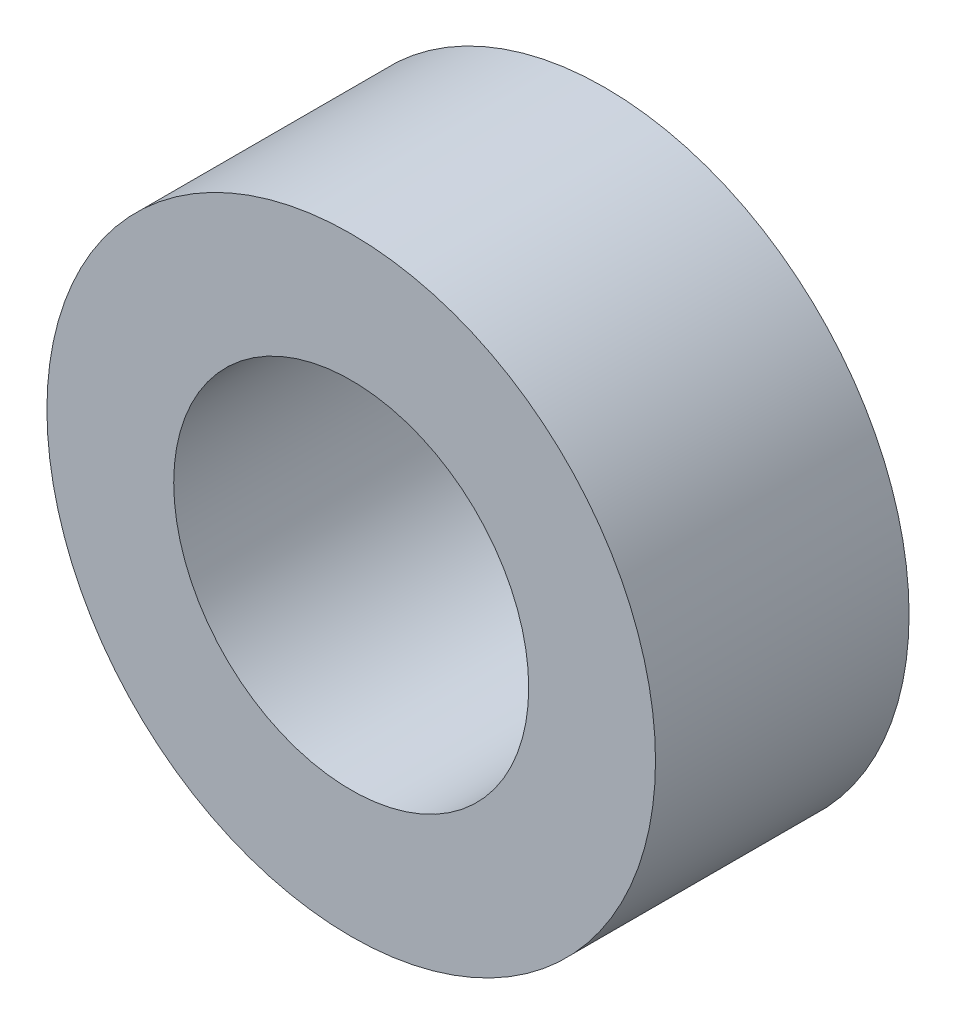
ISO-10303-21;
HEADER;
FILE_DESCRIPTION(('STEP AP214'),'2;1');
FILE_NAME('part.step','',(''),(''),'','','');
FILE_SCHEMA(('AUTOMOTIVE_DESIGN { 1 0 10303 214 1 1 1 1 }'));
ENDSEC;
DATA;
#1=APPLICATION_CONTEXT('core data for automotive mechanical design processes');
#2=APPLICATION_PROTOCOL_DEFINITION('international standard','automotive_design',2000,#1);
#3=PRODUCT_CONTEXT('',#1,'mechanical');
#4=PRODUCT('Part','Part','',(#3));
#5=PRODUCT_RELATED_PRODUCT_CATEGORY('part','',(#4));
#6=PRODUCT_DEFINITION_FORMATION('','',#4);
#7=PRODUCT_DEFINITION_CONTEXT('part definition',#1,'design');
#8=PRODUCT_DEFINITION('design','',#6,#7);
#9=PRODUCT_DEFINITION_SHAPE('','',#8);
#10=(LENGTH_UNIT() NAMED_UNIT(*) SI_UNIT(.MILLI.,.METRE.));
#11=(NAMED_UNIT(*) PLANE_ANGLE_UNIT() SI_UNIT($,.RADIAN.));
#12=(NAMED_UNIT(*) SI_UNIT($,.STERADIAN.) SOLID_ANGLE_UNIT());
#13=UNCERTAINTY_MEASURE_WITH_UNIT(LENGTH_MEASURE(1.E-05),#10,'distance_accuracy_value','');
#14=(GEOMETRIC_REPRESENTATION_CONTEXT(3) GLOBAL_UNCERTAINTY_ASSIGNED_CONTEXT((#13)) GLOBAL_UNIT_ASSIGNED_CONTEXT((#10,
#11,#12)) REPRESENTATION_CONTEXT('',''));
#15=CARTESIAN_POINT('',(0.,0.,0.));
#16=DIRECTION('',(0.,0.,1.));
#17=DIRECTION('',(1.,0.,0.));
#18=AXIS2_PLACEMENT_3D('',#15,#16,#17);
#19=CARTESIAN_POINT('',(0.,0.,0.));
#20=DIRECTION('',(0.,0.,1.));
#21=DIRECTION('',(1.,0.,0.));
#22=AXIS2_PLACEMENT_3D('',#19,#20,#21);
#23=CYLINDRICAL_SURFACE('',#22,6.);
#24=CARTESIAN_POINT('',(0.,0.,0.));
#25=DIRECTION('',(0.,0.,1.));
#26=DIRECTION('',(-1.,0.,0.));
#27=AXIS2_PLACEMENT_3D('',#24,#25,#26);
#28=CIRCLE('',#27,6.);
#29=CARTESIAN_POINT('',(-6.,0.,0.));
#30=VERTEX_POINT('',#29);
#31=EDGE_CURVE('E10',#30,#30,#28,.T.);
#32=ORIENTED_EDGE('',*,*,#31,.T.);
#33=EDGE_LOOP('',(#32));
#34=FACE_BOUND('',#33,.T.);
#35=CARTESIAN_POINT('',(0.,0.,5.));
#36=DIRECTION('',(0.,0.,1.));
#37=DIRECTION('',(-1.,0.,0.));
#38=AXIS2_PLACEMENT_3D('',#35,#36,#37);
#39=CIRCLE('',#38,6.);
#40=CARTESIAN_POINT('',(-6.,0.,5.));
#41=VERTEX_POINT('',#40);
#42=EDGE_CURVE('E33',#41,#41,#39,.T.);
#43=ORIENTED_EDGE('',*,*,#42,.F.);
#44=EDGE_LOOP('',(#43));
#45=FACE_BOUND('',#44,.T.);
#46=ADVANCED_FACE('F30',(#34,#45),#23,.T.);
#47=CARTESIAN_POINT('',(0.,0.,0.));
#48=DIRECTION('',(0.,0.,-1.));
#49=DIRECTION('',(-1.,0.,0.));
#50=AXIS2_PLACEMENT_3D('',#47,#48,#49);
#51=PLANE('',#50);
#52=CARTESIAN_POINT('',(0.,0.,0.));
#53=DIRECTION('',(0.,0.,1.));
#54=DIRECTION('',(-1.,0.,0.));
#55=AXIS2_PLACEMENT_3D('',#52,#53,#54);
#56=CIRCLE('',#55,3.5);
#57=CARTESIAN_POINT('',(-3.5,0.,0.));
#58=VERTEX_POINT('',#57);
#59=EDGE_CURVE('E40',#58,#58,#56,.T.);
#60=ORIENTED_EDGE('',*,*,#59,.T.);
#61=EDGE_LOOP('',(#60));
#62=FACE_BOUND('',#61,.T.);
#63=ORIENTED_EDGE('',*,*,#31,.F.);
#64=EDGE_LOOP('',(#63));
#65=FACE_BOUND('',#64,.T.);
#66=ADVANCED_FACE('F48',(#62,#65),#51,.T.);
#67=CARTESIAN_POINT('',(0.,0.,5.));
#68=DIRECTION('',(0.,0.,-1.));
#69=DIRECTION('',(-1.,0.,0.));
#70=AXIS2_PLACEMENT_3D('',#67,#68,#69);
#71=PLANE('',#70);
#72=CARTESIAN_POINT('',(0.,0.,5.));
#73=DIRECTION('',(0.,0.,1.));
#74=DIRECTION('',(-1.,0.,0.));
#75=AXIS2_PLACEMENT_3D('',#72,#73,#74);
#76=CIRCLE('',#75,3.5);
#77=CARTESIAN_POINT('',(-3.5,0.,5.));
#78=VERTEX_POINT('',#77);
#79=EDGE_CURVE('E42',#78,#78,#76,.T.);
#80=ORIENTED_EDGE('',*,*,#79,.F.);
#81=EDGE_LOOP('',(#80));
#82=FACE_BOUND('',#81,.T.);
#83=ORIENTED_EDGE('',*,*,#42,.T.);
#84=EDGE_LOOP('',(#83));
#85=FACE_BOUND('',#84,.T.);
#86=ADVANCED_FACE('F54',(#82,#85),#71,.F.);
#87=CARTESIAN_POINT('',(0.,0.,0.));
#88=DIRECTION('',(0.,0.,1.));
#89=DIRECTION('',(1.,0.,0.));
#90=AXIS2_PLACEMENT_3D('',#87,#88,#89);
#91=CYLINDRICAL_SURFACE('',#90,3.5);
#92=ORIENTED_EDGE('',*,*,#59,.F.);
#93=EDGE_LOOP('',(#92));
#94=FACE_BOUND('',#93,.T.);
#95=ORIENTED_EDGE('',*,*,#79,.T.);
#96=EDGE_LOOP('',(#95));
#97=FACE_BOUND('',#96,.T.);
#98=ADVANCED_FACE('F51',(#94,#97),#91,.F.);
#99=CLOSED_SHELL('',(#46,#66,#86,#98));
#100=MANIFOLD_SOLID_BREP('B2',#99);
#101=ADVANCED_BREP_SHAPE_REPRESENTATION('',(#18,#100),#14);
#102=SHAPE_DEFINITION_REPRESENTATION(#9,#101);
ENDSEC;
END-ISO-10303-21;
